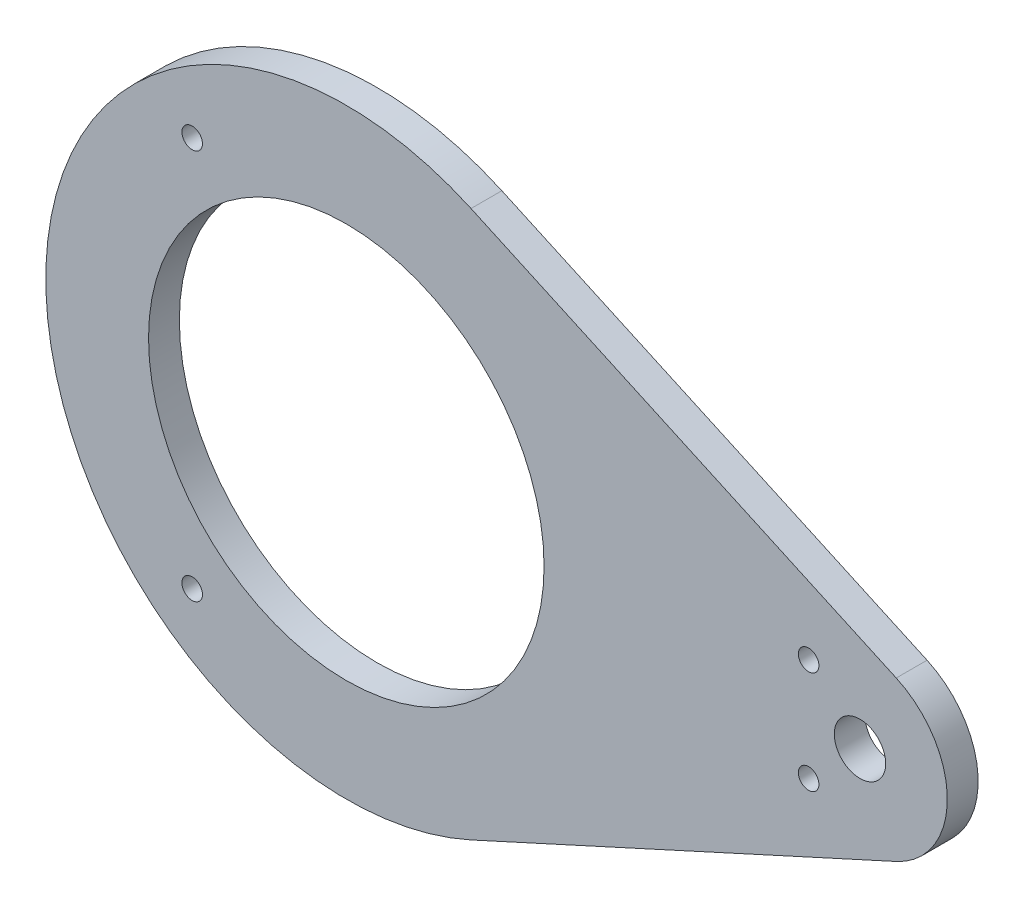
ISO-10303-21;
HEADER;
FILE_DESCRIPTION(('STEP AP214'),'2;1');
FILE_NAME('part.step','',(''),(''),'','','');
FILE_SCHEMA(('AUTOMOTIVE_DESIGN { 1 0 10303 214 1 1 1 1 }'));
ENDSEC;
DATA;
#1=APPLICATION_CONTEXT('core data for automotive mechanical design processes');
#2=APPLICATION_PROTOCOL_DEFINITION('international standard','automotive_design',2000,#1);
#3=PRODUCT_CONTEXT('',#1,'mechanical');
#4=PRODUCT('Part','Part','',(#3));
#5=PRODUCT_RELATED_PRODUCT_CATEGORY('part','',(#4));
#6=PRODUCT_DEFINITION_FORMATION('','',#4);
#7=PRODUCT_DEFINITION_CONTEXT('part definition',#1,'design');
#8=PRODUCT_DEFINITION('design','',#6,#7);
#9=PRODUCT_DEFINITION_SHAPE('','',#8);
#10=(LENGTH_UNIT() NAMED_UNIT(*) SI_UNIT(.MILLI.,.METRE.));
#11=(NAMED_UNIT(*) PLANE_ANGLE_UNIT() SI_UNIT($,.RADIAN.));
#12=(NAMED_UNIT(*) SI_UNIT($,.STERADIAN.) SOLID_ANGLE_UNIT());
#13=UNCERTAINTY_MEASURE_WITH_UNIT(LENGTH_MEASURE(1.E-05),#10,'distance_accuracy_value','');
#14=(GEOMETRIC_REPRESENTATION_CONTEXT(3) GLOBAL_UNCERTAINTY_ASSIGNED_CONTEXT((#13)) GLOBAL_UNIT_ASSIGNED_CONTEXT((#10,
#11,#12)) REPRESENTATION_CONTEXT('',''));
#15=CARTESIAN_POINT('',(0.,0.,0.));
#16=DIRECTION('',(0.,0.,1.));
#17=DIRECTION('',(1.,0.,0.));
#18=AXIS2_PLACEMENT_3D('',#15,#16,#17);
#19=CARTESIAN_POINT('',(0.,0.,42.));
#20=DIRECTION('',(0.,0.,-1.));
#21=DIRECTION('',(-1.,0.,0.));
#22=AXIS2_PLACEMENT_3D('',#19,#20,#21);
#23=CYLINDRICAL_SURFACE('',#22,29.25);
#24=DIRECTION('',(0.,0.,-1.));
#25=VECTOR('',#24,1.);
#26=CARTESIAN_POINT('',(12.13875,-26.6122762731319,42.));
#27=LINE('',#26,#25);
#28=CARTESIAN_POINT('',(12.13875,-26.6122762731319,3.00000000000002));
#29=VERTEX_POINT('',#28);
#30=CARTESIAN_POINT('',(12.13875,-26.6122762731319,0.));
#31=VERTEX_POINT('',#30);
#32=EDGE_CURVE('E87',#29,#31,#27,.T.);
#33=ORIENTED_EDGE('',*,*,#32,.F.);
#34=CARTESIAN_POINT('',(0.,0.,3.));
#35=DIRECTION('',(0.,0.,-1.));
#36=DIRECTION('',(-1.,0.,0.));
#37=AXIS2_PLACEMENT_3D('',#34,#35,#36);
#38=CIRCLE('',#37,29.25);
#39=CARTESIAN_POINT('',(12.13875,26.6122762731319,3.));
#40=VERTEX_POINT('',#39);
#41=EDGE_CURVE('E49',#29,#40,#38,.T.);
#42=ORIENTED_EDGE('',*,*,#41,.T.);
#43=DIRECTION('',(0.,0.,-1.));
#44=VECTOR('',#43,1.);
#45=CARTESIAN_POINT('',(12.13875,26.6122762731319,42.));
#46=LINE('',#45,#44);
#47=CARTESIAN_POINT('',(12.13875,26.6122762731319,0.));
#48=VERTEX_POINT('',#47);
#49=EDGE_CURVE('E42',#40,#48,#46,.T.);
#50=ORIENTED_EDGE('',*,*,#49,.T.);
#51=CARTESIAN_POINT('',(0.,0.,0.));
#52=DIRECTION('',(0.,0.,1.));
#53=DIRECTION('',(1.,0.,0.));
#54=AXIS2_PLACEMENT_3D('',#51,#52,#53);
#55=CIRCLE('',#54,29.25);
#56=EDGE_CURVE('E90',#48,#31,#55,.T.);
#57=ORIENTED_EDGE('',*,*,#56,.T.);
#58=EDGE_LOOP('',(#33,#42,#50,#57));
#59=FACE_BOUND('',#58,.T.);
#60=ADVANCED_FACE('F33',(#59),#23,.T.);
#61=CARTESIAN_POINT('',(50.,0.,0.));
#62=DIRECTION('',(0.,0.,-1.));
#63=DIRECTION('',(-1.,0.,0.));
#64=AXIS2_PLACEMENT_3D('',#61,#62,#63);
#65=PLANE('',#64);
#66=CARTESIAN_POINT('',(-15.,-19.,0.));
#67=DIRECTION('',(0.,0.,1.));
#68=DIRECTION('',(-1.,0.,0.));
#69=AXIS2_PLACEMENT_3D('',#66,#67,#68);
#70=CIRCLE('',#69,1.);
#71=CARTESIAN_POINT('',(-14.,-19.,0.));
#72=VERTEX_POINT('',#71);
#73=EDGE_CURVE('E125',#72,#72,#70,.T.);
#74=ORIENTED_EDGE('',*,*,#73,.T.);
#75=EDGE_LOOP('',(#74));
#76=FACE_BOUND('',#75,.T.);
#77=CARTESIAN_POINT('',(-15.,19.,0.));
#78=DIRECTION('',(0.,0.,1.));
#79=DIRECTION('',(1.,0.,0.));
#80=AXIS2_PLACEMENT_3D('',#77,#78,#79);
#81=CIRCLE('',#80,1.);
#82=CARTESIAN_POINT('',(-14.,19.,0.));
#83=VERTEX_POINT('',#82);
#84=EDGE_CURVE('E122',#83,#83,#81,.T.);
#85=ORIENTED_EDGE('',*,*,#84,.T.);
#86=EDGE_LOOP('',(#85));
#87=FACE_BOUND('',#86,.T.);
#88=CARTESIAN_POINT('',(45.,-5.,0.));
#89=DIRECTION('',(0.,0.,1.));
#90=DIRECTION('',(-1.,0.,0.));
#91=AXIS2_PLACEMENT_3D('',#88,#89,#90);
#92=CIRCLE('',#91,0.999999999999998);
#93=CARTESIAN_POINT('',(46.,-5.,0.));
#94=VERTEX_POINT('',#93);
#95=EDGE_CURVE('E119',#94,#94,#92,.T.);
#96=ORIENTED_EDGE('',*,*,#95,.T.);
#97=EDGE_LOOP('',(#96));
#98=FACE_BOUND('',#97,.T.);
#99=CARTESIAN_POINT('',(45.,5.,0.));
#100=DIRECTION('',(0.,0.,1.));
#101=DIRECTION('',(1.,0.,0.));
#102=AXIS2_PLACEMENT_3D('',#99,#100,#101);
#103=CIRCLE('',#102,0.999999999999998);
#104=CARTESIAN_POINT('',(46.,5.,0.));
#105=VERTEX_POINT('',#104);
#106=EDGE_CURVE('E116',#105,#105,#103,.T.);
#107=ORIENTED_EDGE('',*,*,#106,.T.);
#108=EDGE_LOOP('',(#107));
#109=FACE_BOUND('',#108,.T.);
#110=CARTESIAN_POINT('',(0.,0.,0.));
#111=DIRECTION('',(0.,0.,1.));
#112=DIRECTION('',(1.,0.,0.));
#113=AXIS2_PLACEMENT_3D('',#110,#111,#112);
#114=CIRCLE('',#113,19.25);
#115=CARTESIAN_POINT('',(-19.25,0.,0.));
#116=VERTEX_POINT('',#115);
#117=EDGE_CURVE('E110',#116,#116,#114,.T.);
#118=ORIENTED_EDGE('',*,*,#117,.T.);
#119=EDGE_LOOP('',(#118));
#120=FACE_BOUND('',#119,.T.);
#121=CARTESIAN_POINT('',(50.,0.,0.));
#122=DIRECTION('',(0.,0.,1.));
#123=DIRECTION('',(-1.,0.,0.));
#124=AXIS2_PLACEMENT_3D('',#121,#122,#123);
#125=CIRCLE('',#124,8.5);
#126=CARTESIAN_POINT('',(53.5275,-7.73348199390158,0.));
#127=VERTEX_POINT('',#126);
#128=CARTESIAN_POINT('',(53.5275,7.73348199390159,0.));
#129=VERTEX_POINT('',#128);
#130=EDGE_CURVE('E104',#127,#129,#125,.T.);
#131=ORIENTED_EDGE('',*,*,#130,.F.);
#132=DIRECTION('',(0.909821411047245,0.415,0.));
#133=VECTOR('',#132,1.);
#134=CARTESIAN_POINT('',(12.13875,-26.6122762731319,0.));
#135=LINE('',#134,#133);
#136=EDGE_CURVE('E85',#31,#127,#135,.T.);
#137=ORIENTED_EDGE('',*,*,#136,.F.);
#138=ORIENTED_EDGE('',*,*,#56,.F.);
#139=DIRECTION('',(-0.909821411047245,0.415,0.));
#140=VECTOR('',#139,1.);
#141=CARTESIAN_POINT('',(12.13875,26.6122762731319,0.));
#142=LINE('',#141,#140);
#143=EDGE_CURVE('E101',#129,#48,#142,.T.);
#144=ORIENTED_EDGE('',*,*,#143,.F.);
#145=EDGE_LOOP('',(#131,#137,#138,#144));
#146=FACE_BOUND('',#145,.T.);
#147=CARTESIAN_POINT('',(50.,0.,0.));
#148=DIRECTION('',(0.,0.,1.));
#149=DIRECTION('',(1.,0.,0.));
#150=AXIS2_PLACEMENT_3D('',#147,#148,#149);
#151=CIRCLE('',#150,2.5);
#152=CARTESIAN_POINT('',(47.5,0.,0.));
#153=VERTEX_POINT('',#152);
#154=EDGE_CURVE('E113',#153,#153,#151,.T.);
#155=ORIENTED_EDGE('',*,*,#154,.T.);
#156=EDGE_LOOP('',(#155));
#157=FACE_BOUND('',#156,.T.);
#158=ADVANCED_FACE('F106',(#76,#87,#98,#109,#120,#146,#157),#65,.T.);
#159=CARTESIAN_POINT('',(50.,0.,42.));
#160=DIRECTION('',(0.,0.,-1.));
#161=DIRECTION('',(-1.,0.,0.));
#162=AXIS2_PLACEMENT_3D('',#159,#160,#161);
#163=CYLINDRICAL_SURFACE('',#162,8.5);
#164=CARTESIAN_POINT('',(50.,0.,3.));
#165=DIRECTION('',(0.,0.,-1.));
#166=DIRECTION('',(-1.,0.,0.));
#167=AXIS2_PLACEMENT_3D('',#164,#165,#166);
#168=CIRCLE('',#167,8.5);
#169=CARTESIAN_POINT('',(53.5275,7.73348199390159,3.));
#170=VERTEX_POINT('',#169);
#171=CARTESIAN_POINT('',(53.5275,-7.73348199390158,3.));
#172=VERTEX_POINT('',#171);
#173=EDGE_CURVE('E74',#170,#172,#168,.T.);
#174=ORIENTED_EDGE('',*,*,#173,.T.);
#175=DIRECTION('',(0.,0.,-1.));
#176=VECTOR('',#175,1.);
#177=CARTESIAN_POINT('',(53.5275,-7.73348199390158,42.));
#178=LINE('',#177,#176);
#179=EDGE_CURVE('E57',#172,#127,#178,.T.);
#180=ORIENTED_EDGE('',*,*,#179,.T.);
#181=ORIENTED_EDGE('',*,*,#130,.T.);
#182=DIRECTION('',(0.,0.,-1.));
#183=VECTOR('',#182,1.);
#184=CARTESIAN_POINT('',(53.5275,7.73348199390159,42.));
#185=LINE('',#184,#183);
#186=EDGE_CURVE('E11',#170,#129,#185,.T.);
#187=ORIENTED_EDGE('',*,*,#186,.F.);
#188=EDGE_LOOP('',(#174,#180,#181,#187));
#189=FACE_BOUND('',#188,.T.);
#190=ADVANCED_FACE('F35',(#189),#163,.T.);
#191=CARTESIAN_POINT('',(12.13875,26.6122762731319,42.));
#192=DIRECTION('',(-0.415,-0.909821411047245,0.));
#193=DIRECTION('',(0.909821411047245,-0.415,0.));
#194=AXIS2_PLACEMENT_3D('',#191,#192,#193);
#195=PLANE('',#194);
#196=ORIENTED_EDGE('',*,*,#49,.F.);
#197=DIRECTION('',(0.909821411047245,-0.415,0.));
#198=VECTOR('',#197,1.);
#199=CARTESIAN_POINT('',(12.13875,26.6122762731319,3.));
#200=LINE('',#199,#198);
#201=EDGE_CURVE('E128',#40,#170,#200,.T.);
#202=ORIENTED_EDGE('',*,*,#201,.T.);
#203=ORIENTED_EDGE('',*,*,#186,.T.);
#204=ORIENTED_EDGE('',*,*,#143,.T.);
#205=EDGE_LOOP('',(#196,#202,#203,#204));
#206=FACE_BOUND('',#205,.T.);
#207=ADVANCED_FACE('F102',(#206),#195,.F.);
#208=CARTESIAN_POINT('',(12.13875,-26.6122762731319,42.));
#209=DIRECTION('',(-0.415,0.909821411047245,0.));
#210=DIRECTION('',(-0.909821411047245,-0.415,0.));
#211=AXIS2_PLACEMENT_3D('',#208,#209,#210);
#212=PLANE('',#211);
#213=ORIENTED_EDGE('',*,*,#179,.F.);
#214=DIRECTION('',(-0.909821411047245,-0.415,0.));
#215=VECTOR('',#214,1.);
#216=CARTESIAN_POINT('',(12.13875,-26.6122762731319,3.));
#217=LINE('',#216,#215);
#218=EDGE_CURVE('E76',#172,#29,#217,.T.);
#219=ORIENTED_EDGE('',*,*,#218,.T.);
#220=ORIENTED_EDGE('',*,*,#32,.T.);
#221=ORIENTED_EDGE('',*,*,#136,.T.);
#222=EDGE_LOOP('',(#213,#219,#220,#221));
#223=FACE_BOUND('',#222,.T.);
#224=ADVANCED_FACE('F83',(#223),#212,.F.);
#225=CARTESIAN_POINT('',(0.,0.,42.));
#226=DIRECTION('',(0.,0.,-1.));
#227=DIRECTION('',(-1.,0.,0.));
#228=AXIS2_PLACEMENT_3D('',#225,#226,#227);
#229=CYLINDRICAL_SURFACE('',#228,19.25);
#230=CARTESIAN_POINT('',(0.,0.,3.));
#231=DIRECTION('',(0.,0.,-1.));
#232=DIRECTION('',(-1.,0.,0.));
#233=AXIS2_PLACEMENT_3D('',#230,#231,#232);
#234=CIRCLE('',#233,19.25);
#235=CARTESIAN_POINT('',(-19.25,0.,3.));
#236=VERTEX_POINT('',#235);
#237=EDGE_CURVE('E81',#236,#236,#234,.T.);
#238=CARTESIAN_POINT('',(-19.25,0.,3.));
#239=CARTESIAN_POINT('',(-19.25,0.,2.96875));
#240=CARTESIAN_POINT('',(-19.25,0.,2.9375));
#241=CARTESIAN_POINT('',(-19.25,0.,2.875));
#242=CARTESIAN_POINT('',(-19.25,0.,2.84375));
#243=CARTESIAN_POINT('',(-19.25,0.,2.78125));
#244=CARTESIAN_POINT('',(-19.25,0.,2.75));
#245=CARTESIAN_POINT('',(-19.25,0.,2.6875));
#246=CARTESIAN_POINT('',(-19.25,0.,2.65625));
#247=CARTESIAN_POINT('',(-19.25,0.,2.59375));
#248=CARTESIAN_POINT('',(-19.25,0.,2.5625));
#249=CARTESIAN_POINT('',(-19.25,0.,2.5));
#250=CARTESIAN_POINT('',(-19.25,0.,2.46875));
#251=CARTESIAN_POINT('',(-19.25,0.,2.40625));
#252=CARTESIAN_POINT('',(-19.25,0.,2.375));
#253=CARTESIAN_POINT('',(-19.25,0.,2.3125));
#254=CARTESIAN_POINT('',(-19.25,0.,2.28125));
#255=CARTESIAN_POINT('',(-19.25,0.,2.21875));
#256=CARTESIAN_POINT('',(-19.25,0.,2.1875));
#257=CARTESIAN_POINT('',(-19.25,0.,2.125));
#258=CARTESIAN_POINT('',(-19.25,0.,2.09375));
#259=CARTESIAN_POINT('',(-19.25,0.,2.03125));
#260=CARTESIAN_POINT('',(-19.25,0.,2.));
#261=CARTESIAN_POINT('',(-19.25,0.,1.9375));
#262=CARTESIAN_POINT('',(-19.25,0.,1.90625));
#263=CARTESIAN_POINT('',(-19.25,0.,1.84375));
#264=CARTESIAN_POINT('',(-19.25,0.,1.8125));
#265=CARTESIAN_POINT('',(-19.25,0.,1.75));
#266=CARTESIAN_POINT('',(-19.25,0.,1.71875));
#267=CARTESIAN_POINT('',(-19.25,0.,1.65625));
#268=CARTESIAN_POINT('',(-19.25,0.,1.625));
#269=CARTESIAN_POINT('',(-19.25,0.,1.5625));
#270=CARTESIAN_POINT('',(-19.25,0.,1.53125));
#271=CARTESIAN_POINT('',(-19.25,0.,1.46875));
#272=CARTESIAN_POINT('',(-19.25,0.,1.4375));
#273=CARTESIAN_POINT('',(-19.25,0.,1.375));
#274=CARTESIAN_POINT('',(-19.25,0.,1.34375));
#275=CARTESIAN_POINT('',(-19.25,0.,1.28125));
#276=CARTESIAN_POINT('',(-19.25,0.,1.25));
#277=CARTESIAN_POINT('',(-19.25,0.,1.1875));
#278=CARTESIAN_POINT('',(-19.25,0.,1.15625));
#279=CARTESIAN_POINT('',(-19.25,0.,1.09375));
#280=CARTESIAN_POINT('',(-19.25,0.,1.0625));
#281=CARTESIAN_POINT('',(-19.25,0.,0.999999999999999));
#282=CARTESIAN_POINT('',(-19.25,0.,0.96875));
#283=CARTESIAN_POINT('',(-19.25,0.,0.906250000000002));
#284=CARTESIAN_POINT('',(-19.25,0.,0.875000000000003));
#285=CARTESIAN_POINT('',(-19.25,0.,0.812500000000003));
#286=CARTESIAN_POINT('',(-19.25,0.,0.781250000000002));
#287=CARTESIAN_POINT('',(-19.25,0.,0.718749999999999));
#288=CARTESIAN_POINT('',(-19.25,0.,0.687499999999998));
#289=CARTESIAN_POINT('',(-19.25,0.,0.624999999999998));
#290=CARTESIAN_POINT('',(-19.25,0.,0.593749999999999));
#291=CARTESIAN_POINT('',(-19.25,0.,0.531250000000002));
#292=CARTESIAN_POINT('',(-19.25,0.,0.500000000000003));
#293=CARTESIAN_POINT('',(-19.25,0.,0.437500000000003));
#294=CARTESIAN_POINT('',(-19.25,0.,0.406250000000002));
#295=CARTESIAN_POINT('',(-19.25,0.,0.343749999999999));
#296=CARTESIAN_POINT('',(-19.25,0.,0.312499999999998));
#297=CARTESIAN_POINT('',(-19.25,0.,0.249999999999998));
#298=CARTESIAN_POINT('',(-19.25,0.,0.218749999999999));
#299=CARTESIAN_POINT('',(-19.25,0.,0.156250000000001));
#300=CARTESIAN_POINT('',(-19.25,0.,0.125000000000002));
#301=CARTESIAN_POINT('',(-19.25,0.,0.0625000000000024));
#302=CARTESIAN_POINT('',(-19.25,0.,0.0312500000000012));
#303=CARTESIAN_POINT('',(-19.25,0.,0.));
#304=B_SPLINE_CURVE_WITH_KNOTS('',3,(#238,#239,#240,#241,#242,#243,#244,#245,#246,#247,#248,
#249,#250,#251,#252,#253,#254,#255,#256,#257,#258,#259,#260,#261,#262,#263,#264,#265,#266,#267,
#268,#269,#270,#271,#272,#273,#274,#275,#276,#277,#278,#279,#280,#281,#282,#283,#284,#285,#286,
#287,#288,#289,#290,#291,#292,#293,#294,#295,#296,#297,#298,#299,#300,#301,#302,#303),
.UNSPECIFIED.,.F.,.F.,(4,2,2,2,2,2,2,2,2,2,2,2,2,2,2,2,2,2,2,2,2,2,2,2,2,2,2,2,2,2,2,2,4),(0.,
0.0937500000000036,0.1875,0.281249999999997,0.375,0.468750000000004,0.5625,0.656249999999997,
0.750000000000001,0.843750000000004,0.937500000000001,1.03125,1.125,1.21875,1.3125,1.40625,1.5,
1.59375,1.6875,1.78125,1.875,1.96875000000001,2.0625,2.15625,2.25,2.34375000000001,2.4375,
2.53125,2.625,2.71875000000001,2.8125,2.90625,3.),.UNSPECIFIED.);
#305=EDGE_CURVE('BSEAM173',#236,#116,#304,.T.);
#306=ORIENTED_EDGE('',*,*,#237,.F.);
#307=ORIENTED_EDGE('',*,*,#117,.F.);
#308=ORIENTED_EDGE('',*,*,#305,.T.);
#309=ORIENTED_EDGE('',*,*,#305,.F.);
#310=EDGE_LOOP('',(#306,#308,#307,#309));
#311=FACE_BOUND('',#310,.T.);
#312=ADVANCED_FACE('F173',(#311),#229,.F.);
#313=CARTESIAN_POINT('',(50.,0.,42.));
#314=DIRECTION('',(0.,0.,-1.));
#315=DIRECTION('',(-1.,0.,0.));
#316=AXIS2_PLACEMENT_3D('',#313,#314,#315);
#317=CYLINDRICAL_SURFACE('',#316,2.5);
#318=CARTESIAN_POINT('',(50.,0.,3.));
#319=DIRECTION('',(0.,0.,-1.));
#320=DIRECTION('',(-1.,0.,0.));
#321=AXIS2_PLACEMENT_3D('',#318,#319,#320);
#322=CIRCLE('',#321,2.5);
#323=CARTESIAN_POINT('',(47.5,0.,3.));
#324=VERTEX_POINT('',#323);
#325=EDGE_CURVE('E133',#324,#324,#322,.T.);
#326=CARTESIAN_POINT('',(47.5,0.,3.));
#327=CARTESIAN_POINT('',(47.5,0.,2.96875));
#328=CARTESIAN_POINT('',(47.5,0.,2.9375));
#329=CARTESIAN_POINT('',(47.5,0.,2.875));
#330=CARTESIAN_POINT('',(47.5,0.,2.84375));
#331=CARTESIAN_POINT('',(47.5,0.,2.78125));
#332=CARTESIAN_POINT('',(47.5,0.,2.75));
#333=CARTESIAN_POINT('',(47.5,0.,2.6875));
#334=CARTESIAN_POINT('',(47.5,0.,2.65625));
#335=CARTESIAN_POINT('',(47.5,0.,2.59375));
#336=CARTESIAN_POINT('',(47.5,0.,2.5625));
#337=CARTESIAN_POINT('',(47.5,0.,2.5));
#338=CARTESIAN_POINT('',(47.5,0.,2.46875));
#339=CARTESIAN_POINT('',(47.5,0.,2.40625));
#340=CARTESIAN_POINT('',(47.5,0.,2.375));
#341=CARTESIAN_POINT('',(47.5,0.,2.3125));
#342=CARTESIAN_POINT('',(47.5,0.,2.28125));
#343=CARTESIAN_POINT('',(47.5,0.,2.21875));
#344=CARTESIAN_POINT('',(47.5,0.,2.1875));
#345=CARTESIAN_POINT('',(47.5,0.,2.125));
#346=CARTESIAN_POINT('',(47.5,0.,2.09375));
#347=CARTESIAN_POINT('',(47.5,0.,2.03125));
#348=CARTESIAN_POINT('',(47.5,0.,2.));
#349=CARTESIAN_POINT('',(47.5,0.,1.9375));
#350=CARTESIAN_POINT('',(47.5,0.,1.90625));
#351=CARTESIAN_POINT('',(47.5,0.,1.84375));
#352=CARTESIAN_POINT('',(47.5,0.,1.8125));
#353=CARTESIAN_POINT('',(47.5,0.,1.75));
#354=CARTESIAN_POINT('',(47.5,0.,1.71875));
#355=CARTESIAN_POINT('',(47.5,0.,1.65625));
#356=CARTESIAN_POINT('',(47.5,0.,1.625));
#357=CARTESIAN_POINT('',(47.5,0.,1.5625));
#358=CARTESIAN_POINT('',(47.5,0.,1.53125));
#359=CARTESIAN_POINT('',(47.5,0.,1.46875));
#360=CARTESIAN_POINT('',(47.5,0.,1.4375));
#361=CARTESIAN_POINT('',(47.5,0.,1.375));
#362=CARTESIAN_POINT('',(47.5,0.,1.34375));
#363=CARTESIAN_POINT('',(47.5,0.,1.28125));
#364=CARTESIAN_POINT('',(47.5,0.,1.25));
#365=CARTESIAN_POINT('',(47.5,0.,1.1875));
#366=CARTESIAN_POINT('',(47.5,0.,1.15625));
#367=CARTESIAN_POINT('',(47.5,0.,1.09375));
#368=CARTESIAN_POINT('',(47.5,0.,1.0625));
#369=CARTESIAN_POINT('',(47.5,0.,0.999999999999999));
#370=CARTESIAN_POINT('',(47.5,0.,0.96875));
#371=CARTESIAN_POINT('',(47.5,0.,0.906250000000002));
#372=CARTESIAN_POINT('',(47.5,0.,0.875000000000003));
#373=CARTESIAN_POINT('',(47.5,0.,0.812500000000003));
#374=CARTESIAN_POINT('',(47.5,0.,0.781250000000002));
#375=CARTESIAN_POINT('',(47.5,0.,0.718749999999999));
#376=CARTESIAN_POINT('',(47.5,0.,0.687499999999998));
#377=CARTESIAN_POINT('',(47.5,0.,0.624999999999998));
#378=CARTESIAN_POINT('',(47.5,0.,0.593749999999999));
#379=CARTESIAN_POINT('',(47.5,0.,0.531250000000002));
#380=CARTESIAN_POINT('',(47.5,0.,0.500000000000003));
#381=CARTESIAN_POINT('',(47.5,0.,0.437500000000003));
#382=CARTESIAN_POINT('',(47.5,0.,0.406250000000002));
#383=CARTESIAN_POINT('',(47.5,0.,0.343749999999999));
#384=CARTESIAN_POINT('',(47.5,0.,0.312499999999998));
#385=CARTESIAN_POINT('',(47.5,0.,0.249999999999998));
#386=CARTESIAN_POINT('',(47.5,0.,0.218749999999999));
#387=CARTESIAN_POINT('',(47.5,0.,0.156250000000001));
#388=CARTESIAN_POINT('',(47.5,0.,0.125000000000002));
#389=CARTESIAN_POINT('',(47.5,0.,0.0625000000000024));
#390=CARTESIAN_POINT('',(47.5,0.,0.0312500000000012));
#391=CARTESIAN_POINT('',(47.5,0.,0.));
#392=B_SPLINE_CURVE_WITH_KNOTS('',3,(#326,#327,#328,#329,#330,#331,#332,#333,#334,#335,#336,
#337,#338,#339,#340,#341,#342,#343,#344,#345,#346,#347,#348,#349,#350,#351,#352,#353,#354,#355,
#356,#357,#358,#359,#360,#361,#362,#363,#364,#365,#366,#367,#368,#369,#370,#371,#372,#373,#374,
#375,#376,#377,#378,#379,#380,#381,#382,#383,#384,#385,#386,#387,#388,#389,#390,#391),
.UNSPECIFIED.,.F.,.F.,(4,2,2,2,2,2,2,2,2,2,2,2,2,2,2,2,2,2,2,2,2,2,2,2,2,2,2,2,2,2,2,2,4),(0.,
0.0937500000000036,0.1875,0.281249999999997,0.375,0.468750000000004,0.5625,0.656249999999997,
0.750000000000001,0.843750000000004,0.937500000000001,1.03125,1.125,1.21875,1.3125,1.40625,1.5,
1.59375,1.6875,1.78125,1.875,1.96875000000001,2.0625,2.15625,2.25,2.34375000000001,2.4375,
2.53125,2.625,2.71875000000001,2.8125,2.90625,3.),.UNSPECIFIED.);
#393=EDGE_CURVE('BSEAM163',#324,#153,#392,.T.);
#394=ORIENTED_EDGE('',*,*,#325,.F.);
#395=ORIENTED_EDGE('',*,*,#154,.F.);
#396=ORIENTED_EDGE('',*,*,#393,.T.);
#397=ORIENTED_EDGE('',*,*,#393,.F.);
#398=EDGE_LOOP('',(#394,#396,#395,#397));
#399=FACE_BOUND('',#398,.T.);
#400=ADVANCED_FACE('F163',(#399),#317,.F.);
#401=CARTESIAN_POINT('',(45.,5.,0.));
#402=DIRECTION('',(0.,0.,1.));
#403=DIRECTION('',(1.,0.,0.));
#404=AXIS2_PLACEMENT_3D('',#401,#402,#403);
#405=CYLINDRICAL_SURFACE('',#404,0.999999999999998);
#406=CARTESIAN_POINT('',(45.,5.,3.));
#407=DIRECTION('',(0.,0.,-1.));
#408=DIRECTION('',(-1.,0.,0.));
#409=AXIS2_PLACEMENT_3D('',#406,#407,#408);
#410=CIRCLE('',#409,0.999999999999998);
#411=CARTESIAN_POINT('',(46.,5.,3.));
#412=VERTEX_POINT('',#411);
#413=EDGE_CURVE('E136',#412,#412,#410,.F.);
#414=CARTESIAN_POINT('',(46.,5.,3.));
#415=CARTESIAN_POINT('',(46.,5.,2.96875));
#416=CARTESIAN_POINT('',(46.,5.,2.9375));
#417=CARTESIAN_POINT('',(46.,5.,2.875));
#418=CARTESIAN_POINT('',(46.,5.,2.84375));
#419=CARTESIAN_POINT('',(46.,5.,2.78125));
#420=CARTESIAN_POINT('',(46.,5.,2.75));
#421=CARTESIAN_POINT('',(46.,5.,2.6875));
#422=CARTESIAN_POINT('',(46.,5.,2.65625));
#423=CARTESIAN_POINT('',(46.,5.,2.59375));
#424=CARTESIAN_POINT('',(46.,5.,2.5625));
#425=CARTESIAN_POINT('',(46.,5.,2.5));
#426=CARTESIAN_POINT('',(46.,5.,2.46875));
#427=CARTESIAN_POINT('',(46.,5.,2.40625));
#428=CARTESIAN_POINT('',(46.,5.,2.375));
#429=CARTESIAN_POINT('',(46.,5.,2.3125));
#430=CARTESIAN_POINT('',(46.,5.,2.28125));
#431=CARTESIAN_POINT('',(46.,5.,2.21875));
#432=CARTESIAN_POINT('',(46.,5.,2.1875));
#433=CARTESIAN_POINT('',(46.,5.,2.125));
#434=CARTESIAN_POINT('',(46.,5.,2.09375));
#435=CARTESIAN_POINT('',(46.,5.,2.03125));
#436=CARTESIAN_POINT('',(46.,5.,2.));
#437=CARTESIAN_POINT('',(46.,5.,1.9375));
#438=CARTESIAN_POINT('',(46.,5.,1.90625));
#439=CARTESIAN_POINT('',(46.,5.,1.84375));
#440=CARTESIAN_POINT('',(46.,5.,1.8125));
#441=CARTESIAN_POINT('',(46.,5.,1.75));
#442=CARTESIAN_POINT('',(46.,5.,1.71875));
#443=CARTESIAN_POINT('',(46.,5.,1.65625));
#444=CARTESIAN_POINT('',(46.,5.,1.625));
#445=CARTESIAN_POINT('',(46.,5.,1.5625));
#446=CARTESIAN_POINT('',(46.,5.,1.53125));
#447=CARTESIAN_POINT('',(46.,5.,1.46875));
#448=CARTESIAN_POINT('',(46.,5.,1.4375));
#449=CARTESIAN_POINT('',(46.,5.,1.375));
#450=CARTESIAN_POINT('',(46.,5.,1.34375));
#451=CARTESIAN_POINT('',(46.,5.,1.28125));
#452=CARTESIAN_POINT('',(46.,5.,1.25));
#453=CARTESIAN_POINT('',(46.,5.,1.1875));
#454=CARTESIAN_POINT('',(46.,5.,1.15625));
#455=CARTESIAN_POINT('',(46.,5.,1.09375));
#456=CARTESIAN_POINT('',(46.,5.,1.0625));
#457=CARTESIAN_POINT('',(46.,5.,1.));
#458=CARTESIAN_POINT('',(46.,5.,0.968750000000001));
#459=CARTESIAN_POINT('',(46.,5.,0.906250000000001));
#460=CARTESIAN_POINT('',(46.,5.,0.875000000000001));
#461=CARTESIAN_POINT('',(46.,5.,0.812500000000001));
#462=CARTESIAN_POINT('',(46.,5.,0.781250000000001));
#463=CARTESIAN_POINT('',(46.,5.,0.718750000000001));
#464=CARTESIAN_POINT('',(46.,5.,0.687500000000001));
#465=CARTESIAN_POINT('',(46.,5.,0.625));
#466=CARTESIAN_POINT('',(46.,5.,0.59375));
#467=CARTESIAN_POINT('',(46.,5.,0.53125));
#468=CARTESIAN_POINT('',(46.,5.,0.5));
#469=CARTESIAN_POINT('',(46.,5.,0.4375));
#470=CARTESIAN_POINT('',(46.,5.,0.40625));
#471=CARTESIAN_POINT('',(46.,5.,0.34375));
#472=CARTESIAN_POINT('',(46.,5.,0.3125));
#473=CARTESIAN_POINT('',(46.,5.,0.25));
#474=CARTESIAN_POINT('',(46.,5.,0.21875));
#475=CARTESIAN_POINT('',(46.,5.,0.15625));
#476=CARTESIAN_POINT('',(46.,5.,0.125));
#477=CARTESIAN_POINT('',(46.,5.,0.0625000000000001));
#478=CARTESIAN_POINT('',(46.,5.,0.03125));
#479=CARTESIAN_POINT('',(46.,5.,0.));
#480=B_SPLINE_CURVE_WITH_KNOTS('',3,(#414,#415,#416,#417,#418,#419,#420,#421,#422,#423,#424,
#425,#426,#427,#428,#429,#430,#431,#432,#433,#434,#435,#436,#437,#438,#439,#440,#441,#442,#443,
#444,#445,#446,#447,#448,#449,#450,#451,#452,#453,#454,#455,#456,#457,#458,#459,#460,#461,#462,
#463,#464,#465,#466,#467,#468,#469,#470,#471,#472,#473,#474,#475,#476,#477,#478,#479),
.UNSPECIFIED.,.F.,.F.,(4,2,2,2,2,2,2,2,2,2,2,2,2,2,2,2,2,2,2,2,2,2,2,2,2,2,2,2,2,2,2,2,4),(0.,
0.0937500000000001,0.1875,0.28125,0.375,0.46875,0.5625,0.656250000000001,0.750000000000001,
0.843750000000001,0.937500000000001,1.03125,1.125,1.21875,1.3125,1.40625,1.5,1.59375,1.6875,
1.78125,1.875,1.96875,2.0625,2.15625,2.25,2.34375,2.4375,2.53125,2.625,2.71875,2.8125,2.90625,
3.),.UNSPECIFIED.);
#481=EDGE_CURVE('BSEAM159',#412,#105,#480,.T.);
#482=ORIENTED_EDGE('',*,*,#413,.T.);
#483=ORIENTED_EDGE('',*,*,#106,.F.);
#484=ORIENTED_EDGE('',*,*,#481,.T.);
#485=ORIENTED_EDGE('',*,*,#481,.F.);
#486=EDGE_LOOP('',(#482,#484,#483,#485));
#487=FACE_BOUND('',#486,.T.);
#488=ADVANCED_FACE('F159',(#487),#405,.F.);
#489=CARTESIAN_POINT('',(45.,-5.,0.));
#490=DIRECTION('',(0.,0.,1.));
#491=DIRECTION('',(1.,0.,0.));
#492=AXIS2_PLACEMENT_3D('',#489,#490,#491);
#493=CYLINDRICAL_SURFACE('',#492,0.999999999999998);
#494=CARTESIAN_POINT('',(45.,-5.,3.));
#495=DIRECTION('',(0.,0.,-1.));
#496=DIRECTION('',(-1.,0.,0.));
#497=AXIS2_PLACEMENT_3D('',#494,#495,#496);
#498=CIRCLE('',#497,0.999999999999998);
#499=CARTESIAN_POINT('',(46.,-5.,3.));
#500=VERTEX_POINT('',#499);
#501=EDGE_CURVE('E139',#500,#500,#498,.F.);
#502=CARTESIAN_POINT('',(46.,-5.,3.));
#503=CARTESIAN_POINT('',(46.,-5.,2.96875));
#504=CARTESIAN_POINT('',(46.,-5.,2.9375));
#505=CARTESIAN_POINT('',(46.,-5.,2.875));
#506=CARTESIAN_POINT('',(46.,-5.,2.84375));
#507=CARTESIAN_POINT('',(46.,-5.,2.78125));
#508=CARTESIAN_POINT('',(46.,-5.,2.75));
#509=CARTESIAN_POINT('',(46.,-5.,2.6875));
#510=CARTESIAN_POINT('',(46.,-5.,2.65625));
#511=CARTESIAN_POINT('',(46.,-5.,2.59375));
#512=CARTESIAN_POINT('',(46.,-5.,2.5625));
#513=CARTESIAN_POINT('',(46.,-5.,2.5));
#514=CARTESIAN_POINT('',(46.,-5.,2.46875));
#515=CARTESIAN_POINT('',(46.,-5.,2.40625));
#516=CARTESIAN_POINT('',(46.,-5.,2.375));
#517=CARTESIAN_POINT('',(46.,-5.,2.3125));
#518=CARTESIAN_POINT('',(46.,-5.,2.28125));
#519=CARTESIAN_POINT('',(46.,-5.,2.21875));
#520=CARTESIAN_POINT('',(46.,-5.,2.1875));
#521=CARTESIAN_POINT('',(46.,-5.,2.125));
#522=CARTESIAN_POINT('',(46.,-5.,2.09375));
#523=CARTESIAN_POINT('',(46.,-5.,2.03125));
#524=CARTESIAN_POINT('',(46.,-5.,2.));
#525=CARTESIAN_POINT('',(46.,-5.,1.9375));
#526=CARTESIAN_POINT('',(46.,-5.,1.90625));
#527=CARTESIAN_POINT('',(46.,-5.,1.84375));
#528=CARTESIAN_POINT('',(46.,-5.,1.8125));
#529=CARTESIAN_POINT('',(46.,-5.,1.75));
#530=CARTESIAN_POINT('',(46.,-5.,1.71875));
#531=CARTESIAN_POINT('',(46.,-5.,1.65625));
#532=CARTESIAN_POINT('',(46.,-5.,1.625));
#533=CARTESIAN_POINT('',(46.,-5.,1.5625));
#534=CARTESIAN_POINT('',(46.,-5.,1.53125));
#535=CARTESIAN_POINT('',(46.,-5.,1.46875));
#536=CARTESIAN_POINT('',(46.,-5.,1.4375));
#537=CARTESIAN_POINT('',(46.,-5.,1.375));
#538=CARTESIAN_POINT('',(46.,-5.,1.34375));
#539=CARTESIAN_POINT('',(46.,-5.,1.28125));
#540=CARTESIAN_POINT('',(46.,-5.,1.25));
#541=CARTESIAN_POINT('',(46.,-5.,1.1875));
#542=CARTESIAN_POINT('',(46.,-5.,1.15625));
#543=CARTESIAN_POINT('',(46.,-5.,1.09375));
#544=CARTESIAN_POINT('',(46.,-5.,1.0625));
#545=CARTESIAN_POINT('',(46.,-5.,1.));
#546=CARTESIAN_POINT('',(46.,-5.,0.968750000000001));
#547=CARTESIAN_POINT('',(46.,-5.,0.906250000000001));
#548=CARTESIAN_POINT('',(46.,-5.,0.875000000000001));
#549=CARTESIAN_POINT('',(46.,-5.,0.812500000000001));
#550=CARTESIAN_POINT('',(46.,-5.,0.781250000000001));
#551=CARTESIAN_POINT('',(46.,-5.,0.718750000000001));
#552=CARTESIAN_POINT('',(46.,-5.,0.687500000000001));
#553=CARTESIAN_POINT('',(46.,-5.,0.625));
#554=CARTESIAN_POINT('',(46.,-5.,0.59375));
#555=CARTESIAN_POINT('',(46.,-5.,0.53125));
#556=CARTESIAN_POINT('',(46.,-5.,0.5));
#557=CARTESIAN_POINT('',(46.,-5.,0.4375));
#558=CARTESIAN_POINT('',(46.,-5.,0.40625));
#559=CARTESIAN_POINT('',(46.,-5.,0.34375));
#560=CARTESIAN_POINT('',(46.,-5.,0.3125));
#561=CARTESIAN_POINT('',(46.,-5.,0.25));
#562=CARTESIAN_POINT('',(46.,-5.,0.21875));
#563=CARTESIAN_POINT('',(46.,-5.,0.15625));
#564=CARTESIAN_POINT('',(46.,-5.,0.125));
#565=CARTESIAN_POINT('',(46.,-5.,0.0625000000000001));
#566=CARTESIAN_POINT('',(46.,-5.,0.03125));
#567=CARTESIAN_POINT('',(46.,-5.,0.));
#568=B_SPLINE_CURVE_WITH_KNOTS('',3,(#502,#503,#504,#505,#506,#507,#508,#509,#510,#511,#512,
#513,#514,#515,#516,#517,#518,#519,#520,#521,#522,#523,#524,#525,#526,#527,#528,#529,#530,#531,
#532,#533,#534,#535,#536,#537,#538,#539,#540,#541,#542,#543,#544,#545,#546,#547,#548,#549,#550,
#551,#552,#553,#554,#555,#556,#557,#558,#559,#560,#561,#562,#563,#564,#565,#566,#567),
.UNSPECIFIED.,.F.,.F.,(4,2,2,2,2,2,2,2,2,2,2,2,2,2,2,2,2,2,2,2,2,2,2,2,2,2,2,2,2,2,2,2,4),(0.,
0.0937500000000001,0.1875,0.28125,0.375,0.46875,0.5625,0.656250000000001,0.750000000000001,
0.843750000000001,0.937500000000001,1.03125,1.125,1.21875,1.3125,1.40625,1.5,1.59375,1.6875,
1.78125,1.875,1.96875,2.0625,2.15625,2.25,2.34375,2.4375,2.53125,2.625,2.71875,2.8125,2.90625,
3.),.UNSPECIFIED.);
#569=EDGE_CURVE('BSEAM162',#500,#94,#568,.T.);
#570=ORIENTED_EDGE('',*,*,#501,.T.);
#571=ORIENTED_EDGE('',*,*,#95,.F.);
#572=ORIENTED_EDGE('',*,*,#569,.T.);
#573=ORIENTED_EDGE('',*,*,#569,.F.);
#574=EDGE_LOOP('',(#570,#572,#571,#573));
#575=FACE_BOUND('',#574,.T.);
#576=ADVANCED_FACE('F162',(#575),#493,.F.);
#577=CARTESIAN_POINT('',(-15.,19.,0.));
#578=DIRECTION('',(0.,0.,1.));
#579=DIRECTION('',(1.,0.,0.));
#580=AXIS2_PLACEMENT_3D('',#577,#578,#579);
#581=CYLINDRICAL_SURFACE('',#580,1.);
#582=CARTESIAN_POINT('',(-15.,19.,3.));
#583=DIRECTION('',(0.,0.,-1.));
#584=DIRECTION('',(-1.,0.,0.));
#585=AXIS2_PLACEMENT_3D('',#582,#583,#584);
#586=CIRCLE('',#585,1.);
#587=CARTESIAN_POINT('',(-14.,19.,3.));
#588=VERTEX_POINT('',#587);
#589=EDGE_CURVE('E142',#588,#588,#586,.F.);
#590=CARTESIAN_POINT('',(-14.,19.,3.));
#591=CARTESIAN_POINT('',(-14.,19.,2.96875));
#592=CARTESIAN_POINT('',(-14.,19.,2.9375));
#593=CARTESIAN_POINT('',(-14.,19.,2.875));
#594=CARTESIAN_POINT('',(-14.,19.,2.84375));
#595=CARTESIAN_POINT('',(-14.,19.,2.78125));
#596=CARTESIAN_POINT('',(-14.,19.,2.75));
#597=CARTESIAN_POINT('',(-14.,19.,2.6875));
#598=CARTESIAN_POINT('',(-14.,19.,2.65625));
#599=CARTESIAN_POINT('',(-14.,19.,2.59375));
#600=CARTESIAN_POINT('',(-14.,19.,2.5625));
#601=CARTESIAN_POINT('',(-14.,19.,2.5));
#602=CARTESIAN_POINT('',(-14.,19.,2.46875));
#603=CARTESIAN_POINT('',(-14.,19.,2.40625));
#604=CARTESIAN_POINT('',(-14.,19.,2.375));
#605=CARTESIAN_POINT('',(-14.,19.,2.3125));
#606=CARTESIAN_POINT('',(-14.,19.,2.28125));
#607=CARTESIAN_POINT('',(-14.,19.,2.21875));
#608=CARTESIAN_POINT('',(-14.,19.,2.1875));
#609=CARTESIAN_POINT('',(-14.,19.,2.125));
#610=CARTESIAN_POINT('',(-14.,19.,2.09375));
#611=CARTESIAN_POINT('',(-14.,19.,2.03125));
#612=CARTESIAN_POINT('',(-14.,19.,2.));
#613=CARTESIAN_POINT('',(-14.,19.,1.9375));
#614=CARTESIAN_POINT('',(-14.,19.,1.90625));
#615=CARTESIAN_POINT('',(-14.,19.,1.84375));
#616=CARTESIAN_POINT('',(-14.,19.,1.8125));
#617=CARTESIAN_POINT('',(-14.,19.,1.75));
#618=CARTESIAN_POINT('',(-14.,19.,1.71875));
#619=CARTESIAN_POINT('',(-14.,19.,1.65625));
#620=CARTESIAN_POINT('',(-14.,19.,1.625));
#621=CARTESIAN_POINT('',(-14.,19.,1.5625));
#622=CARTESIAN_POINT('',(-14.,19.,1.53125));
#623=CARTESIAN_POINT('',(-14.,19.,1.46875));
#624=CARTESIAN_POINT('',(-14.,19.,1.4375));
#625=CARTESIAN_POINT('',(-14.,19.,1.375));
#626=CARTESIAN_POINT('',(-14.,19.,1.34375));
#627=CARTESIAN_POINT('',(-14.,19.,1.28125));
#628=CARTESIAN_POINT('',(-14.,19.,1.25));
#629=CARTESIAN_POINT('',(-14.,19.,1.1875));
#630=CARTESIAN_POINT('',(-14.,19.,1.15625));
#631=CARTESIAN_POINT('',(-14.,19.,1.09375));
#632=CARTESIAN_POINT('',(-14.,19.,1.0625));
#633=CARTESIAN_POINT('',(-14.,19.,1.));
#634=CARTESIAN_POINT('',(-14.,19.,0.968750000000001));
#635=CARTESIAN_POINT('',(-14.,19.,0.906250000000001));
#636=CARTESIAN_POINT('',(-14.,19.,0.875000000000001));
#637=CARTESIAN_POINT('',(-14.,19.,0.812500000000001));
#638=CARTESIAN_POINT('',(-14.,19.,0.781250000000001));
#639=CARTESIAN_POINT('',(-14.,19.,0.718750000000001));
#640=CARTESIAN_POINT('',(-14.,19.,0.687500000000001));
#641=CARTESIAN_POINT('',(-14.,19.,0.625));
#642=CARTESIAN_POINT('',(-14.,19.,0.59375));
#643=CARTESIAN_POINT('',(-14.,19.,0.53125));
#644=CARTESIAN_POINT('',(-14.,19.,0.5));
#645=CARTESIAN_POINT('',(-14.,19.,0.4375));
#646=CARTESIAN_POINT('',(-14.,19.,0.40625));
#647=CARTESIAN_POINT('',(-14.,19.,0.34375));
#648=CARTESIAN_POINT('',(-14.,19.,0.3125));
#649=CARTESIAN_POINT('',(-14.,19.,0.25));
#650=CARTESIAN_POINT('',(-14.,19.,0.21875));
#651=CARTESIAN_POINT('',(-14.,19.,0.15625));
#652=CARTESIAN_POINT('',(-14.,19.,0.125));
#653=CARTESIAN_POINT('',(-14.,19.,0.0625000000000001));
#654=CARTESIAN_POINT('',(-14.,19.,0.03125));
#655=CARTESIAN_POINT('',(-14.,19.,0.));
#656=B_SPLINE_CURVE_WITH_KNOTS('',3,(#590,#591,#592,#593,#594,#595,#596,#597,#598,#599,#600,
#601,#602,#603,#604,#605,#606,#607,#608,#609,#610,#611,#612,#613,#614,#615,#616,#617,#618,#619,
#620,#621,#622,#623,#624,#625,#626,#627,#628,#629,#630,#631,#632,#633,#634,#635,#636,#637,#638,
#639,#640,#641,#642,#643,#644,#645,#646,#647,#648,#649,#650,#651,#652,#653,#654,#655),
.UNSPECIFIED.,.F.,.F.,(4,2,2,2,2,2,2,2,2,2,2,2,2,2,2,2,2,2,2,2,2,2,2,2,2,2,2,2,2,2,2,2,4),(0.,
0.0937500000000001,0.1875,0.28125,0.375,0.46875,0.5625,0.656250000000001,0.750000000000001,
0.843750000000001,0.937500000000001,1.03125,1.125,1.21875,1.3125,1.40625,1.5,1.59375,1.6875,
1.78125,1.875,1.96875,2.0625,2.15625,2.25,2.34375,2.4375,2.53125,2.625,2.71875,2.8125,2.90625,
3.),.UNSPECIFIED.);
#657=EDGE_CURVE('BSEAM234',#588,#83,#656,.T.);
#658=ORIENTED_EDGE('',*,*,#589,.T.);
#659=ORIENTED_EDGE('',*,*,#84,.F.);
#660=ORIENTED_EDGE('',*,*,#657,.T.);
#661=ORIENTED_EDGE('',*,*,#657,.F.);
#662=EDGE_LOOP('',(#658,#660,#659,#661));
#663=FACE_BOUND('',#662,.T.);
#664=ADVANCED_FACE('F234',(#663),#581,.F.);
#665=CARTESIAN_POINT('',(-15.,-19.,0.));
#666=DIRECTION('',(0.,0.,1.));
#667=DIRECTION('',(1.,0.,0.));
#668=AXIS2_PLACEMENT_3D('',#665,#666,#667);
#669=CYLINDRICAL_SURFACE('',#668,1.);
#670=CARTESIAN_POINT('',(-15.,-19.,3.));
#671=DIRECTION('',(0.,0.,-1.));
#672=DIRECTION('',(-1.,0.,0.));
#673=AXIS2_PLACEMENT_3D('',#670,#671,#672);
#674=CIRCLE('',#673,1.);
#675=CARTESIAN_POINT('',(-14.,-19.,3.));
#676=VERTEX_POINT('',#675);
#677=EDGE_CURVE('E37',#676,#676,#674,.F.);
#678=CARTESIAN_POINT('',(-14.,-19.,3.));
#679=CARTESIAN_POINT('',(-14.,-19.,2.96875));
#680=CARTESIAN_POINT('',(-14.,-19.,2.9375));
#681=CARTESIAN_POINT('',(-14.,-19.,2.875));
#682=CARTESIAN_POINT('',(-14.,-19.,2.84375));
#683=CARTESIAN_POINT('',(-14.,-19.,2.78125));
#684=CARTESIAN_POINT('',(-14.,-19.,2.75));
#685=CARTESIAN_POINT('',(-14.,-19.,2.6875));
#686=CARTESIAN_POINT('',(-14.,-19.,2.65625));
#687=CARTESIAN_POINT('',(-14.,-19.,2.59375));
#688=CARTESIAN_POINT('',(-14.,-19.,2.5625));
#689=CARTESIAN_POINT('',(-14.,-19.,2.5));
#690=CARTESIAN_POINT('',(-14.,-19.,2.46875));
#691=CARTESIAN_POINT('',(-14.,-19.,2.40625));
#692=CARTESIAN_POINT('',(-14.,-19.,2.375));
#693=CARTESIAN_POINT('',(-14.,-19.,2.3125));
#694=CARTESIAN_POINT('',(-14.,-19.,2.28125));
#695=CARTESIAN_POINT('',(-14.,-19.,2.21875));
#696=CARTESIAN_POINT('',(-14.,-19.,2.1875));
#697=CARTESIAN_POINT('',(-14.,-19.,2.125));
#698=CARTESIAN_POINT('',(-14.,-19.,2.09375));
#699=CARTESIAN_POINT('',(-14.,-19.,2.03125));
#700=CARTESIAN_POINT('',(-14.,-19.,2.));
#701=CARTESIAN_POINT('',(-14.,-19.,1.9375));
#702=CARTESIAN_POINT('',(-14.,-19.,1.90625));
#703=CARTESIAN_POINT('',(-14.,-19.,1.84375));
#704=CARTESIAN_POINT('',(-14.,-19.,1.8125));
#705=CARTESIAN_POINT('',(-14.,-19.,1.75));
#706=CARTESIAN_POINT('',(-14.,-19.,1.71875));
#707=CARTESIAN_POINT('',(-14.,-19.,1.65625));
#708=CARTESIAN_POINT('',(-14.,-19.,1.625));
#709=CARTESIAN_POINT('',(-14.,-19.,1.5625));
#710=CARTESIAN_POINT('',(-14.,-19.,1.53125));
#711=CARTESIAN_POINT('',(-14.,-19.,1.46875));
#712=CARTESIAN_POINT('',(-14.,-19.,1.4375));
#713=CARTESIAN_POINT('',(-14.,-19.,1.375));
#714=CARTESIAN_POINT('',(-14.,-19.,1.34375));
#715=CARTESIAN_POINT('',(-14.,-19.,1.28125));
#716=CARTESIAN_POINT('',(-14.,-19.,1.25));
#717=CARTESIAN_POINT('',(-14.,-19.,1.1875));
#718=CARTESIAN_POINT('',(-14.,-19.,1.15625));
#719=CARTESIAN_POINT('',(-14.,-19.,1.09375));
#720=CARTESIAN_POINT('',(-14.,-19.,1.0625));
#721=CARTESIAN_POINT('',(-14.,-19.,1.));
#722=CARTESIAN_POINT('',(-14.,-19.,0.968750000000001));
#723=CARTESIAN_POINT('',(-14.,-19.,0.906250000000001));
#724=CARTESIAN_POINT('',(-14.,-19.,0.875000000000001));
#725=CARTESIAN_POINT('',(-14.,-19.,0.812500000000001));
#726=CARTESIAN_POINT('',(-14.,-19.,0.781250000000001));
#727=CARTESIAN_POINT('',(-14.,-19.,0.718750000000001));
#728=CARTESIAN_POINT('',(-14.,-19.,0.687500000000001));
#729=CARTESIAN_POINT('',(-14.,-19.,0.625));
#730=CARTESIAN_POINT('',(-14.,-19.,0.59375));
#731=CARTESIAN_POINT('',(-14.,-19.,0.53125));
#732=CARTESIAN_POINT('',(-14.,-19.,0.5));
#733=CARTESIAN_POINT('',(-14.,-19.,0.4375));
#734=CARTESIAN_POINT('',(-14.,-19.,0.40625));
#735=CARTESIAN_POINT('',(-14.,-19.,0.34375));
#736=CARTESIAN_POINT('',(-14.,-19.,0.3125));
#737=CARTESIAN_POINT('',(-14.,-19.,0.25));
#738=CARTESIAN_POINT('',(-14.,-19.,0.21875));
#739=CARTESIAN_POINT('',(-14.,-19.,0.15625));
#740=CARTESIAN_POINT('',(-14.,-19.,0.125));
#741=CARTESIAN_POINT('',(-14.,-19.,0.0625000000000001));
#742=CARTESIAN_POINT('',(-14.,-19.,0.03125));
#743=CARTESIAN_POINT('',(-14.,-19.,0.));
#744=B_SPLINE_CURVE_WITH_KNOTS('',3,(#678,#679,#680,#681,#682,#683,#684,#685,#686,#687,#688,
#689,#690,#691,#692,#693,#694,#695,#696,#697,#698,#699,#700,#701,#702,#703,#704,#705,#706,#707,
#708,#709,#710,#711,#712,#713,#714,#715,#716,#717,#718,#719,#720,#721,#722,#723,#724,#725,#726,
#727,#728,#729,#730,#731,#732,#733,#734,#735,#736,#737,#738,#739,#740,#741,#742,#743),
.UNSPECIFIED.,.F.,.F.,(4,2,2,2,2,2,2,2,2,2,2,2,2,2,2,2,2,2,2,2,2,2,2,2,2,2,2,2,2,2,2,2,4),(0.,
0.0937500000000001,0.1875,0.28125,0.375,0.46875,0.5625,0.656250000000001,0.750000000000001,
0.843750000000001,0.937500000000001,1.03125,1.125,1.21875,1.3125,1.40625,1.5,1.59375,1.6875,
1.78125,1.875,1.96875,2.0625,2.15625,2.25,2.34375,2.4375,2.53125,2.625,2.71875,2.8125,2.90625,
3.),.UNSPECIFIED.);
#745=EDGE_CURVE('BSEAM149',#676,#72,#744,.T.);
#746=ORIENTED_EDGE('',*,*,#677,.T.);
#747=ORIENTED_EDGE('',*,*,#73,.F.);
#748=ORIENTED_EDGE('',*,*,#745,.T.);
#749=ORIENTED_EDGE('',*,*,#745,.F.);
#750=EDGE_LOOP('',(#746,#748,#747,#749));
#751=FACE_BOUND('',#750,.T.);
#752=ADVANCED_FACE('F149',(#751),#669,.F.);
#753=CARTESIAN_POINT('',(-29.25,-29.25,3.));
#754=DIRECTION('',(0.,0.,-1.));
#755=DIRECTION('',(-1.,0.,0.));
#756=AXIS2_PLACEMENT_3D('',#753,#754,#755);
#757=PLANE('',#756);
#758=ORIENTED_EDGE('',*,*,#237,.T.);
#759=EDGE_LOOP('',(#758));
#760=FACE_BOUND('',#759,.T.);
#761=ORIENTED_EDGE('',*,*,#325,.T.);
#762=EDGE_LOOP('',(#761));
#763=FACE_BOUND('',#762,.T.);
#764=ORIENTED_EDGE('',*,*,#501,.F.);
#765=EDGE_LOOP('',(#764));
#766=FACE_BOUND('',#765,.T.);
#767=ORIENTED_EDGE('',*,*,#677,.F.);
#768=EDGE_LOOP('',(#767));
#769=FACE_BOUND('',#768,.T.);
#770=ORIENTED_EDGE('',*,*,#589,.F.);
#771=EDGE_LOOP('',(#770));
#772=FACE_BOUND('',#771,.T.);
#773=ORIENTED_EDGE('',*,*,#413,.F.);
#774=EDGE_LOOP('',(#773));
#775=FACE_BOUND('',#774,.T.);
#776=ORIENTED_EDGE('',*,*,#41,.F.);
#777=ORIENTED_EDGE('',*,*,#218,.F.);
#778=ORIENTED_EDGE('',*,*,#173,.F.);
#779=ORIENTED_EDGE('',*,*,#201,.F.);
#780=EDGE_LOOP('',(#776,#777,#778,#779));
#781=FACE_BOUND('',#780,.T.);
#782=ADVANCED_FACE('F78',(#760,#763,#766,#769,#772,#775,#781),#757,.F.);
#783=CLOSED_SHELL('',(#60,#158,#190,#207,#224,#312,#400,#488,#576,#664,#752,#782));
#784=MANIFOLD_SOLID_BREP('B2',#783);
#785=ADVANCED_BREP_SHAPE_REPRESENTATION('',(#18,#784),#14);
#786=SHAPE_DEFINITION_REPRESENTATION(#9,#785);
ENDSEC;
END-ISO-10303-21;
